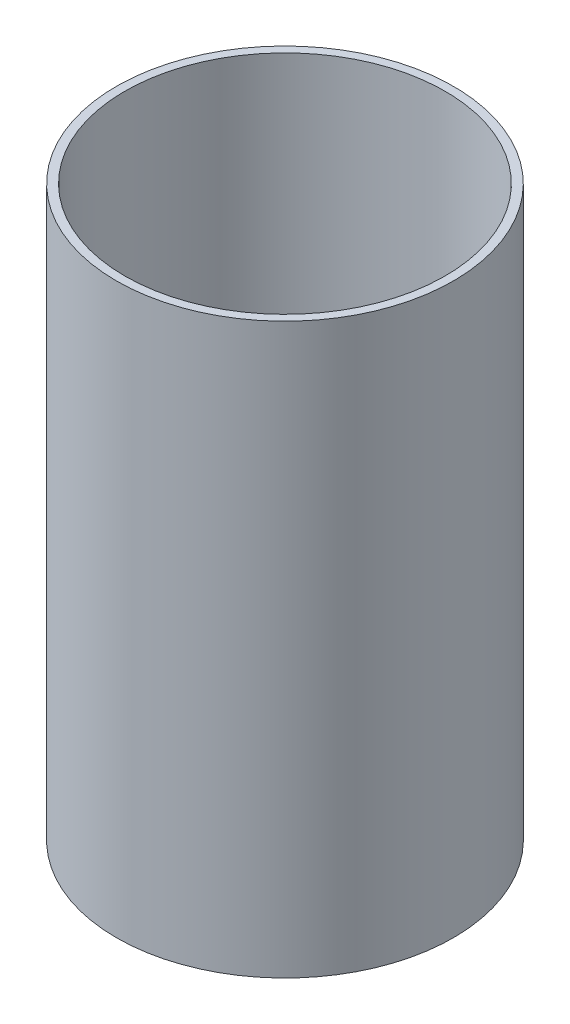
ISO-10303-21;
HEADER;
FILE_DESCRIPTION(('STEP AP214'),'2;1');
FILE_NAME('part.step','',(''),(''),'','','');
FILE_SCHEMA(('AUTOMOTIVE_DESIGN { 1 0 10303 214 1 1 1 1 }'));
ENDSEC;
DATA;
#1=APPLICATION_CONTEXT('core data for automotive mechanical design processes');
#2=APPLICATION_PROTOCOL_DEFINITION('international standard','automotive_design',2000,#1);
#3=PRODUCT_CONTEXT('',#1,'mechanical');
#4=PRODUCT('Part','Part','',(#3));
#5=PRODUCT_RELATED_PRODUCT_CATEGORY('part','',(#4));
#6=PRODUCT_DEFINITION_FORMATION('','',#4);
#7=PRODUCT_DEFINITION_CONTEXT('part definition',#1,'design');
#8=PRODUCT_DEFINITION('design','',#6,#7);
#9=PRODUCT_DEFINITION_SHAPE('','',#8);
#10=(LENGTH_UNIT() NAMED_UNIT(*) SI_UNIT(.MILLI.,.METRE.));
#11=(NAMED_UNIT(*) PLANE_ANGLE_UNIT() SI_UNIT($,.RADIAN.));
#12=(NAMED_UNIT(*) SI_UNIT($,.STERADIAN.) SOLID_ANGLE_UNIT());
#13=UNCERTAINTY_MEASURE_WITH_UNIT(LENGTH_MEASURE(1.E-05),#10,'distance_accuracy_value','');
#14=(GEOMETRIC_REPRESENTATION_CONTEXT(3) GLOBAL_UNCERTAINTY_ASSIGNED_CONTEXT((#13)) GLOBAL_UNIT_ASSIGNED_CONTEXT((#10,
#11,#12)) REPRESENTATION_CONTEXT('',''));
#15=CARTESIAN_POINT('',(0.,0.,0.));
#16=DIRECTION('',(0.,0.,1.));
#17=DIRECTION('',(1.,0.,0.));
#18=AXIS2_PLACEMENT_3D('',#15,#16,#17);
#19=CARTESIAN_POINT('',(0.,135.,0.));
#20=DIRECTION('',(0.,1.,0.));
#21=DIRECTION('',(0.,0.,1.));
#22=AXIS2_PLACEMENT_3D('',#19,#20,#21);
#23=PLANE('',#22);
#24=CARTESIAN_POINT('',(0.,135.,0.));
#25=DIRECTION('',(0.,1.,0.));
#26=DIRECTION('',(0.,0.,1.));
#27=AXIS2_PLACEMENT_3D('',#24,#25,#26);
#28=CIRCLE('',#27,40.);
#29=CARTESIAN_POINT('',(0.,135.,40.));
#30=VERTEX_POINT('',#29);
#31=EDGE_CURVE('E10',#30,#30,#28,.T.);
#32=ORIENTED_EDGE('',*,*,#31,.T.);
#33=EDGE_LOOP('',(#32));
#34=FACE_BOUND('',#33,.T.);
#35=CARTESIAN_POINT('',(0.,135.,0.));
#36=DIRECTION('',(0.,1.,0.));
#37=DIRECTION('',(0.,0.,1.));
#38=AXIS2_PLACEMENT_3D('',#35,#36,#37);
#39=CIRCLE('',#38,38.);
#40=CARTESIAN_POINT('',(0.,135.,38.));
#41=VERTEX_POINT('',#40);
#42=EDGE_CURVE('E42',#41,#41,#39,.T.);
#43=ORIENTED_EDGE('',*,*,#42,.F.);
#44=EDGE_LOOP('',(#43));
#45=FACE_BOUND('',#44,.T.);
#46=ADVANCED_FACE('F31',(#34,#45),#23,.T.);
#47=CARTESIAN_POINT('',(0.,0.,0.));
#48=DIRECTION('',(0.,1.,0.));
#49=DIRECTION('',(0.,0.,1.));
#50=AXIS2_PLACEMENT_3D('',#47,#48,#49);
#51=PLANE('',#50);
#52=CARTESIAN_POINT('',(0.,0.,0.));
#53=DIRECTION('',(0.,1.,0.));
#54=DIRECTION('',(0.,0.,1.));
#55=AXIS2_PLACEMENT_3D('',#52,#53,#54);
#56=CIRCLE('',#55,40.);
#57=CARTESIAN_POINT('',(0.,0.,40.));
#58=VERTEX_POINT('',#57);
#59=EDGE_CURVE('E35',#58,#58,#56,.T.);
#60=ORIENTED_EDGE('',*,*,#59,.F.);
#61=EDGE_LOOP('',(#60));
#62=FACE_BOUND('',#61,.T.);
#63=CARTESIAN_POINT('',(0.,0.,0.));
#64=DIRECTION('',(0.,1.,0.));
#65=DIRECTION('',(0.,0.,1.));
#66=AXIS2_PLACEMENT_3D('',#63,#64,#65);
#67=CIRCLE('',#66,38.);
#68=CARTESIAN_POINT('',(0.,0.,38.));
#69=VERTEX_POINT('',#68);
#70=EDGE_CURVE('E44',#69,#69,#67,.T.);
#71=ORIENTED_EDGE('',*,*,#70,.T.);
#72=EDGE_LOOP('',(#71));
#73=FACE_BOUND('',#72,.T.);
#74=ADVANCED_FACE('F54',(#62,#73),#51,.F.);
#75=CARTESIAN_POINT('',(0.,135.,0.));
#76=DIRECTION('',(0.,-1.,0.));
#77=DIRECTION('',(0.,0.,-1.));
#78=AXIS2_PLACEMENT_3D('',#75,#76,#77);
#79=CYLINDRICAL_SURFACE('',#78,40.);
#80=ORIENTED_EDGE('',*,*,#31,.F.);
#81=EDGE_LOOP('',(#80));
#82=FACE_BOUND('',#81,.T.);
#83=ORIENTED_EDGE('',*,*,#59,.T.);
#84=EDGE_LOOP('',(#83));
#85=FACE_BOUND('',#84,.T.);
#86=ADVANCED_FACE('F33',(#82,#85),#79,.T.);
#87=CARTESIAN_POINT('',(0.,135.,0.));
#88=DIRECTION('',(0.,-1.,0.));
#89=DIRECTION('',(0.,0.,-1.));
#90=AXIS2_PLACEMENT_3D('',#87,#88,#89);
#91=CYLINDRICAL_SURFACE('',#90,38.);
#92=ORIENTED_EDGE('',*,*,#42,.T.);
#93=EDGE_LOOP('',(#92));
#94=FACE_BOUND('',#93,.T.);
#95=ORIENTED_EDGE('',*,*,#70,.F.);
#96=EDGE_LOOP('',(#95));
#97=FACE_BOUND('',#96,.T.);
#98=ADVANCED_FACE('F50',(#94,#97),#91,.F.);
#99=CLOSED_SHELL('',(#46,#74,#86,#98));
#100=MANIFOLD_SOLID_BREP('B2',#99);
#101=ADVANCED_BREP_SHAPE_REPRESENTATION('',(#18,#100),#14);
#102=SHAPE_DEFINITION_REPRESENTATION(#9,#101);
ENDSEC;
END-ISO-10303-21;
